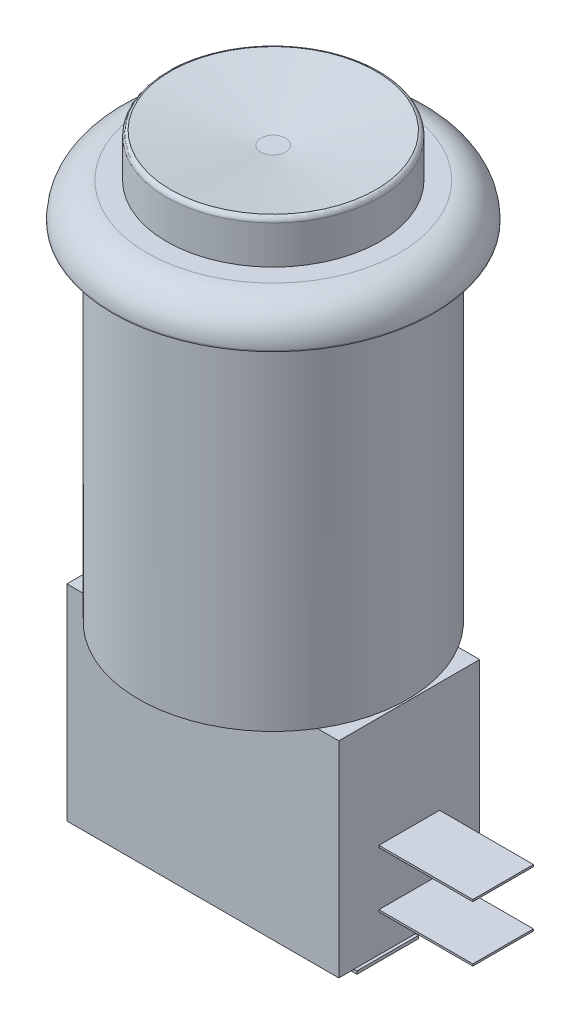
ISO-10303-21;
HEADER;
FILE_DESCRIPTION(('STEP AP214'),'2;1');
FILE_NAME('part.step','',(''),(''),'','','');
FILE_SCHEMA(('AUTOMOTIVE_DESIGN { 1 0 10303 214 1 1 1 1 }'));
ENDSEC;
DATA;
#1=APPLICATION_CONTEXT('core data for automotive mechanical design processes');
#2=APPLICATION_PROTOCOL_DEFINITION('international standard','automotive_design',2000,#1);
#3=PRODUCT_CONTEXT('',#1,'mechanical');
#4=PRODUCT('Part','Part','',(#3));
#5=PRODUCT_RELATED_PRODUCT_CATEGORY('part','',(#4));
#6=PRODUCT_DEFINITION_FORMATION('','',#4);
#7=PRODUCT_DEFINITION_CONTEXT('part definition',#1,'design');
#8=PRODUCT_DEFINITION('design','',#6,#7);
#9=PRODUCT_DEFINITION_SHAPE('','',#8);
#10=(LENGTH_UNIT() NAMED_UNIT(*) SI_UNIT(.MILLI.,.METRE.));
#11=(NAMED_UNIT(*) PLANE_ANGLE_UNIT() SI_UNIT($,.RADIAN.));
#12=(NAMED_UNIT(*) SI_UNIT($,.STERADIAN.) SOLID_ANGLE_UNIT());
#13=UNCERTAINTY_MEASURE_WITH_UNIT(LENGTH_MEASURE(1.E-05),#10,'distance_accuracy_value','');
#14=(GEOMETRIC_REPRESENTATION_CONTEXT(3) GLOBAL_UNCERTAINTY_ASSIGNED_CONTEXT((#13)) GLOBAL_UNIT_ASSIGNED_CONTEXT((#10,
#11,#12)) REPRESENTATION_CONTEXT('',''));
#15=CARTESIAN_POINT('',(0.,0.,0.));
#16=DIRECTION('',(0.,0.,1.));
#17=DIRECTION('',(1.,0.,0.));
#18=AXIS2_PLACEMENT_3D('',#15,#16,#17);
#19=CARTESIAN_POINT('',(13.9,-21.,-7.2));
#20=DIRECTION('',(-1.,0.,0.));
#21=DIRECTION('',(0.,0.,1.));
#22=AXIS2_PLACEMENT_3D('',#19,#20,#21);
#23=PLANE('',#22);
#24=DIRECTION('',(0.,1.,0.));
#25=VECTOR('',#24,1.);
#26=CARTESIAN_POINT('',(13.9,-17.2,-3.1));
#27=LINE('',#26,#25);
#28=CARTESIAN_POINT('',(13.9,-17.2,-3.1));
#29=VERTEX_POINT('',#28);
#30=CARTESIAN_POINT('',(13.9,-17.,-3.1));
#31=VERTEX_POINT('',#30);
#32=EDGE_CURVE('E195',#29,#31,#27,.T.);
#33=ORIENTED_EDGE('',*,*,#32,.F.);
#34=DIRECTION('',(0.,0.,-1.));
#35=VECTOR('',#34,1.);
#36=CARTESIAN_POINT('',(13.9,-17.2,-3.1));
#37=LINE('',#36,#35);
#38=CARTESIAN_POINT('',(13.9,-17.2,3.1));
#39=VERTEX_POINT('',#38);
#40=EDGE_CURVE('E208',#39,#29,#37,.T.);
#41=ORIENTED_EDGE('',*,*,#40,.F.);
#42=DIRECTION('',(0.,-1.,0.));
#43=VECTOR('',#42,1.);
#44=CARTESIAN_POINT('',(13.9,-17.2,3.1));
#45=LINE('',#44,#43);
#46=CARTESIAN_POINT('',(13.9,-17.,3.1));
#47=VERTEX_POINT('',#46);
#48=EDGE_CURVE('E217',#47,#39,#45,.T.);
#49=ORIENTED_EDGE('',*,*,#48,.F.);
#50=DIRECTION('',(0.,0.,1.));
#51=VECTOR('',#50,1.);
#52=CARTESIAN_POINT('',(13.9,-17.,-3.1));
#53=LINE('',#52,#51);
#54=EDGE_CURVE('E198',#31,#47,#53,.T.);
#55=ORIENTED_EDGE('',*,*,#54,.F.);
#56=EDGE_LOOP('',(#33,#41,#49,#55));
#57=FACE_BOUND('',#56,.T.);
#58=DIRECTION('',(0.,0.,1.));
#59=VECTOR('',#58,1.);
#60=CARTESIAN_POINT('',(13.9,0.,-7.2));
#61=LINE('',#60,#59);
#62=CARTESIAN_POINT('',(13.9,0.,-7.2));
#63=VERTEX_POINT('',#62);
#64=CARTESIAN_POINT('',(13.9,0.,7.2));
#65=VERTEX_POINT('',#64);
#66=EDGE_CURVE('E278',#63,#65,#61,.T.);
#67=ORIENTED_EDGE('',*,*,#66,.T.);
#68=DIRECTION('',(0.,1.,0.));
#69=VECTOR('',#68,1.);
#70=CARTESIAN_POINT('',(13.9,-21.,7.2));
#71=LINE('',#70,#69);
#72=CARTESIAN_POINT('',(13.9,-21.,7.2));
#73=VERTEX_POINT('',#72);
#74=EDGE_CURVE('E306',#73,#65,#71,.T.);
#75=ORIENTED_EDGE('',*,*,#74,.F.);
#76=DIRECTION('',(0.,0.,1.));
#77=VECTOR('',#76,1.);
#78=CARTESIAN_POINT('',(13.9,-21.,-7.2));
#79=LINE('',#78,#77);
#80=CARTESIAN_POINT('',(13.9,-21.,-7.2));
#81=VERTEX_POINT('',#80);
#82=EDGE_CURVE('E279',#81,#73,#79,.T.);
#83=ORIENTED_EDGE('',*,*,#82,.F.);
#84=DIRECTION('',(0.,1.,0.));
#85=VECTOR('',#84,1.);
#86=CARTESIAN_POINT('',(13.9,-21.,-7.2));
#87=LINE('',#86,#85);
#88=EDGE_CURVE('E288',#81,#63,#87,.T.);
#89=ORIENTED_EDGE('',*,*,#88,.T.);
#90=EDGE_LOOP('',(#67,#75,#83,#89));
#91=FACE_BOUND('',#90,.T.);
#92=DIRECTION('',(0.,1.,0.));
#93=VECTOR('',#92,1.);
#94=CARTESIAN_POINT('',(13.9,-11.5,-3.1));
#95=LINE('',#94,#93);
#96=CARTESIAN_POINT('',(13.9,-11.5,-3.1));
#97=VERTEX_POINT('',#96);
#98=CARTESIAN_POINT('',(13.9,-11.3,-3.1));
#99=VERTEX_POINT('',#98);
#100=EDGE_CURVE('E194',#97,#99,#95,.T.);
#101=ORIENTED_EDGE('',*,*,#100,.F.);
#102=DIRECTION('',(0.,0.,-1.));
#103=VECTOR('',#102,1.);
#104=CARTESIAN_POINT('',(13.9,-11.5,-3.1));
#105=LINE('',#104,#103);
#106=CARTESIAN_POINT('',(13.9,-11.5,3.1));
#107=VERTEX_POINT('',#106);
#108=EDGE_CURVE('E191',#107,#97,#105,.T.);
#109=ORIENTED_EDGE('',*,*,#108,.F.);
#110=DIRECTION('',(0.,-1.,0.));
#111=VECTOR('',#110,1.);
#112=CARTESIAN_POINT('',(13.9,-11.5,3.1));
#113=LINE('',#112,#111);
#114=CARTESIAN_POINT('',(13.9,-11.3,3.1));
#115=VERTEX_POINT('',#114);
#116=EDGE_CURVE('E57',#115,#107,#113,.T.);
#117=ORIENTED_EDGE('',*,*,#116,.F.);
#118=DIRECTION('',(0.,0.,1.));
#119=VECTOR('',#118,1.);
#120=CARTESIAN_POINT('',(13.9,-11.3,-3.1));
#121=LINE('',#120,#119);
#122=EDGE_CURVE('E52',#99,#115,#121,.T.);
#123=ORIENTED_EDGE('',*,*,#122,.F.);
#124=EDGE_LOOP('',(#101,#109,#117,#123));
#125=FACE_BOUND('',#124,.T.);
#126=ADVANCED_FACE('F33',(#57,#91,#125),#23,.F.);
#127=CARTESIAN_POINT('',(0.,-21.,0.));
#128=DIRECTION('',(0.,1.,0.));
#129=DIRECTION('',(0.,0.,1.));
#130=AXIS2_PLACEMENT_3D('',#127,#128,#129);
#131=PLANE('',#130);
#132=DIRECTION('',(-1.,0.,0.));
#133=VECTOR('',#132,1.);
#134=CARTESIAN_POINT('',(11.7,-21.,3.15));
#135=LINE('',#134,#133);
#136=CARTESIAN_POINT('',(1.9,-21.,3.15));
#137=VERTEX_POINT('',#136);
#138=CARTESIAN_POINT('',(1.7,-21.,3.15));
#139=VERTEX_POINT('',#138);
#140=EDGE_CURVE('E248',#137,#139,#135,.T.);
#141=ORIENTED_EDGE('',*,*,#140,.F.);
#142=DIRECTION('',(0.,0.,1.));
#143=VECTOR('',#142,1.);
#144=CARTESIAN_POINT('',(1.9,-21.,-3.15));
#145=LINE('',#144,#143);
#146=CARTESIAN_POINT('',(1.9,-21.,-3.15));
#147=VERTEX_POINT('',#146);
#148=EDGE_CURVE('E237',#147,#137,#145,.T.);
#149=ORIENTED_EDGE('',*,*,#148,.F.);
#150=DIRECTION('',(1.,0.,0.));
#151=VECTOR('',#150,1.);
#152=CARTESIAN_POINT('',(11.7,-21.,-3.15));
#153=LINE('',#152,#151);
#154=CARTESIAN_POINT('',(1.7,-21.,-3.15));
#155=VERTEX_POINT('',#154);
#156=EDGE_CURVE('E254',#155,#147,#153,.T.);
#157=ORIENTED_EDGE('',*,*,#156,.F.);
#158=DIRECTION('',(0.,0.,-1.));
#159=VECTOR('',#158,1.);
#160=CARTESIAN_POINT('',(1.7,-21.,3.15));
#161=LINE('',#160,#159);
#162=EDGE_CURVE('E262',#139,#155,#161,.T.);
#163=ORIENTED_EDGE('',*,*,#162,.F.);
#164=EDGE_LOOP('',(#141,#149,#157,#163));
#165=FACE_BOUND('',#164,.T.);
#166=ORIENTED_EDGE('',*,*,#82,.T.);
#167=DIRECTION('',(-1.,0.,0.));
#168=VECTOR('',#167,1.);
#169=CARTESIAN_POINT('',(-13.9,-21.,7.2));
#170=LINE('',#169,#168);
#171=CARTESIAN_POINT('',(-13.9,-21.,7.2));
#172=VERTEX_POINT('',#171);
#173=EDGE_CURVE('E282',#73,#172,#170,.T.);
#174=ORIENTED_EDGE('',*,*,#173,.T.);
#175=DIRECTION('',(0.,0.,-1.));
#176=VECTOR('',#175,1.);
#177=CARTESIAN_POINT('',(-13.9,-21.,-7.2));
#178=LINE('',#177,#176);
#179=CARTESIAN_POINT('',(-13.9,-21.,-7.2));
#180=VERTEX_POINT('',#179);
#181=EDGE_CURVE('E284',#172,#180,#178,.T.);
#182=ORIENTED_EDGE('',*,*,#181,.T.);
#183=DIRECTION('',(1.,0.,0.));
#184=VECTOR('',#183,1.);
#185=CARTESIAN_POINT('',(-13.9,-21.,-7.2));
#186=LINE('',#185,#184);
#187=EDGE_CURVE('E286',#180,#81,#186,.T.);
#188=ORIENTED_EDGE('',*,*,#187,.T.);
#189=EDGE_LOOP('',(#166,#174,#182,#188));
#190=FACE_BOUND('',#189,.T.);
#191=ADVANCED_FACE('F359',(#165,#190),#131,.F.);
#192=CARTESIAN_POINT('',(0.,0.,0.));
#193=DIRECTION('',(0.,1.,0.));
#194=DIRECTION('',(0.,0.,1.));
#195=AXIS2_PLACEMENT_3D('',#192,#193,#194);
#196=PLANE('',#195);
#197=DIRECTION('',(1.,0.,0.));
#198=VECTOR('',#197,1.);
#199=CARTESIAN_POINT('',(-13.9,0.,-7.2));
#200=LINE('',#199,#198);
#201=CARTESIAN_POINT('',(-11.7142007836642,0.,-7.2));
#202=VERTEX_POINT('',#201);
#203=CARTESIAN_POINT('',(11.7142007836642,0.,-7.2));
#204=VERTEX_POINT('',#203);
#205=EDGE_CURVE('E11',#202,#204,#200,.T.);
#206=ORIENTED_EDGE('',*,*,#205,.F.);
#207=CARTESIAN_POINT('',(0.,0.,0.));
#208=DIRECTION('',(0.,1.,0.));
#209=DIRECTION('',(0.,0.,1.));
#210=AXIS2_PLACEMENT_3D('',#207,#208,#209);
#211=CIRCLE('',#210,13.75);
#212=EDGE_CURVE('E323',#204,#202,#211,.T.);
#213=ORIENTED_EDGE('',*,*,#212,.F.);
#214=EDGE_LOOP('',(#206,#213));
#215=FACE_BOUND('',#214,.T.);
#216=ADVANCED_FACE('F375',(#215),#196,.F.);
#217=DIRECTION('',(-1.,0.,0.));
#218=VECTOR('',#217,1.);
#219=CARTESIAN_POINT('',(-13.9,0.,7.2));
#220=LINE('',#219,#218);
#221=CARTESIAN_POINT('',(11.7142007836642,0.,7.2));
#222=VERTEX_POINT('',#221);
#223=CARTESIAN_POINT('',(-11.7142007836642,0.,7.2));
#224=VERTEX_POINT('',#223);
#225=EDGE_CURVE('E42',#222,#224,#220,.T.);
#226=ORIENTED_EDGE('',*,*,#225,.F.);
#227=EDGE_CURVE('E315',#224,#222,#211,.T.);
#228=ORIENTED_EDGE('',*,*,#227,.F.);
#229=EDGE_LOOP('',(#226,#228));
#230=FACE_BOUND('',#229,.T.);
#231=ADVANCED_FACE('F373',(#230),#196,.F.);
#232=CARTESIAN_POINT('',(0.,35.5,0.));
#233=DIRECTION('',(0.,-1.,0.));
#234=DIRECTION('',(0.,0.,-1.));
#235=AXIS2_PLACEMENT_3D('',#232,#233,#234);
#236=CYLINDRICAL_SURFACE('',#235,13.75);
#237=CARTESIAN_POINT('',(0.,35.5,0.));
#238=DIRECTION('',(0.,1.,0.));
#239=DIRECTION('',(0.,0.,1.));
#240=AXIS2_PLACEMENT_3D('',#237,#238,#239);
#241=CIRCLE('',#240,13.75);
#242=CARTESIAN_POINT('',(0.,35.5,13.75));
#243=VERTEX_POINT('',#242);
#244=EDGE_CURVE('E316',#243,#243,#241,.T.);
#245=ORIENTED_EDGE('',*,*,#244,.F.);
#246=EDGE_LOOP('',(#245));
#247=FACE_BOUND('',#246,.T.);
#248=EDGE_CURVE('E320',#222,#204,#211,.T.);
#249=ORIENTED_EDGE('',*,*,#248,.T.);
#250=ORIENTED_EDGE('',*,*,#212,.T.);
#251=EDGE_CURVE('E352',#202,#224,#211,.T.);
#252=ORIENTED_EDGE('',*,*,#251,.T.);
#253=ORIENTED_EDGE('',*,*,#227,.T.);
#254=EDGE_LOOP('',(#249,#250,#252,#253));
#255=FACE_BOUND('',#254,.T.);
#256=ADVANCED_FACE('F370',(#247,#255),#236,.T.);
#257=CARTESIAN_POINT('',(0.,39.1,0.));
#258=DIRECTION('',(0.,-1.,0.));
#259=DIRECTION('',(0.,0.,-1.));
#260=AXIS2_PLACEMENT_3D('',#257,#258,#259);
#261=CYLINDRICAL_SURFACE('',#260,16.4);
#262=CARTESIAN_POINT('',(0.,35.6,0.));
#263=DIRECTION('',(0.,1.,0.));
#264=DIRECTION('',(0.,0.,1.));
#265=AXIS2_PLACEMENT_3D('',#262,#263,#264);
#266=CIRCLE('',#265,16.4);
#267=CARTESIAN_POINT('',(0.,35.6,16.4));
#268=VERTEX_POINT('',#267);
#269=EDGE_CURVE('E326',#268,#268,#266,.F.);
#270=ORIENTED_EDGE('',*,*,#269,.T.);
#271=EDGE_LOOP('',(#270));
#272=FACE_BOUND('',#271,.T.);
#273=CARTESIAN_POINT('',(0.,35.5,0.));
#274=DIRECTION('',(0.,1.,0.));
#275=DIRECTION('',(0.,0.,1.));
#276=AXIS2_PLACEMENT_3D('',#273,#274,#275);
#277=CIRCLE('',#276,16.4);
#278=CARTESIAN_POINT('',(0.,35.5,16.4));
#279=VERTEX_POINT('',#278);
#280=EDGE_CURVE('E312',#279,#279,#277,.T.);
#281=ORIENTED_EDGE('',*,*,#280,.T.);
#282=EDGE_LOOP('',(#281));
#283=FACE_BOUND('',#282,.T.);
#284=ADVANCED_FACE('F381',(#272,#283),#261,.T.);
#285=CARTESIAN_POINT('',(0.,39.1,0.));
#286=DIRECTION('',(0.,1.,0.));
#287=DIRECTION('',(0.,0.,1.));
#288=AXIS2_PLACEMENT_3D('',#285,#286,#287);
#289=PLANE('',#288);
#290=CARTESIAN_POINT('',(0.,39.1,0.));
#291=DIRECTION('',(0.,1.,0.));
#292=DIRECTION('',(0.,0.,1.));
#293=AXIS2_PLACEMENT_3D('',#290,#291,#292);
#294=CIRCLE('',#293,12.9);
#295=CARTESIAN_POINT('',(0.,39.1,12.9));
#296=VERTEX_POINT('',#295);
#297=EDGE_CURVE('E319',#296,#296,#294,.T.);
#298=ORIENTED_EDGE('',*,*,#297,.T.);
#299=EDGE_LOOP('',(#298));
#300=FACE_BOUND('',#299,.T.);
#301=CARTESIAN_POINT('',(0.,39.1,0.));
#302=DIRECTION('',(0.,1.,0.));
#303=DIRECTION('',(0.,0.,1.));
#304=AXIS2_PLACEMENT_3D('',#301,#302,#303);
#305=CIRCLE('',#304,10.9);
#306=CARTESIAN_POINT('',(0.,39.1,10.9));
#307=VERTEX_POINT('',#306);
#308=EDGE_CURVE('E309',#307,#307,#305,.T.);
#309=ORIENTED_EDGE('',*,*,#308,.F.);
#310=EDGE_LOOP('',(#309));
#311=FACE_BOUND('',#310,.T.);
#312=ADVANCED_FACE('F406',(#300,#311),#289,.T.);
#313=CARTESIAN_POINT('',(0.,35.5,0.));
#314=DIRECTION('',(0.,1.,0.));
#315=DIRECTION('',(0.,0.,1.));
#316=AXIS2_PLACEMENT_3D('',#313,#314,#315);
#317=PLANE('',#316);
#318=ORIENTED_EDGE('',*,*,#244,.T.);
#319=EDGE_LOOP('',(#318));
#320=FACE_BOUND('',#319,.T.);
#321=ORIENTED_EDGE('',*,*,#280,.F.);
#322=EDGE_LOOP('',(#321));
#323=FACE_BOUND('',#322,.T.);
#324=ADVANCED_FACE('F405',(#320,#323),#317,.F.);
#325=CARTESIAN_POINT('',(0.,43.5,0.));
#326=DIRECTION('',(0.,-1.,0.));
#327=DIRECTION('',(0.,0.,-1.));
#328=AXIS2_PLACEMENT_3D('',#325,#326,#327);
#329=CYLINDRICAL_SURFACE('',#328,10.9);
#330=CARTESIAN_POINT('',(0.,43.0101020514434,0.));
#331=DIRECTION('',(0.,1.,0.));
#332=DIRECTION('',(0.,0.,1.));
#333=AXIS2_PLACEMENT_3D('',#330,#331,#332);
#334=CIRCLE('',#333,10.9);
#335=CARTESIAN_POINT('',(0.,43.0101020514434,10.9));
#336=VERTEX_POINT('',#335);
#337=EDGE_CURVE('E37',#336,#336,#334,.F.);
#338=ORIENTED_EDGE('',*,*,#337,.T.);
#339=EDGE_LOOP('',(#338));
#340=FACE_BOUND('',#339,.T.);
#341=ORIENTED_EDGE('',*,*,#308,.T.);
#342=EDGE_LOOP('',(#341));
#343=FACE_BOUND('',#342,.T.);
#344=ADVANCED_FACE('F402',(#340,#343),#329,.T.);
#345=CARTESIAN_POINT('',(0.,35.6,0.));
#346=DIRECTION('',(0.,1.,0.));
#347=DIRECTION('',(0.,0.,1.));
#348=AXIS2_PLACEMENT_3D('',#345,#346,#347);
#349=TOROIDAL_SURFACE('',#348,12.9,3.5);
#350=ORIENTED_EDGE('',*,*,#269,.F.);
#351=EDGE_LOOP('',(#350));
#352=FACE_BOUND('',#351,.T.);
#353=ORIENTED_EDGE('',*,*,#297,.F.);
#354=EDGE_LOOP('',(#353));
#355=FACE_BOUND('',#354,.T.);
#356=ADVANCED_FACE('F401',(#352,#355),#349,.T.);
#357=CARTESIAN_POINT('',(0.,42.2,0.));
#358=DIRECTION('',(0.,1.,0.));
#359=DIRECTION('',(0.,0.,1.));
#360=AXIS2_PLACEMENT_3D('',#357,#358,#359);
#361=PLANE('',#360);
#362=CARTESIAN_POINT('',(0.,42.2,0.));
#363=DIRECTION('',(0.,1.,0.));
#364=DIRECTION('',(0.,0.,1.));
#365=AXIS2_PLACEMENT_3D('',#362,#363,#364);
#366=CIRCLE('',#365,1.25001936090105);
#367=CARTESIAN_POINT('',(0.,42.2,1.25001936090103));
#368=VERTEX_POINT('',#367);
#369=EDGE_CURVE('E331',#368,#368,#366,.T.);
#370=ORIENTED_EDGE('',*,*,#369,.T.);
#371=EDGE_LOOP('',(#370));
#372=FACE_BOUND('',#371,.T.);
#373=ADVANCED_FACE('F397',(#372),#361,.T.);
#374=CARTESIAN_POINT('',(0.,42.094591652976,0.));
#375=DIRECTION('',(0.,1.,0.));
#376=DIRECTION('',(0.,0.,1.));
#377=AXIS2_PLACEMENT_3D('',#374,#375,#376);
#378=CONICAL_SURFACE('',#377,0.5,1.43116998663534);
#379=CARTESIAN_POINT('',(0.,43.5,0.));
#380=DIRECTION('',(0.,1.,0.));
#381=DIRECTION('',(0.,0.,1.));
#382=AXIS2_PLACEMENT_3D('',#379,#380,#381);
#383=CIRCLE('',#382,10.5);
#384=CARTESIAN_POINT('',(0.,43.5,10.5));
#385=VERTEX_POINT('',#384);
#386=EDGE_CURVE('E329',#385,#385,#383,.F.);
#387=CARTESIAN_POINT('',(0.,43.5,10.5));
#388=CARTESIAN_POINT('',(0.,43.4864583333333,10.4036460350094));
#389=CARTESIAN_POINT('',(0.,43.4729166666667,10.3072920700188));
#390=CARTESIAN_POINT('',(0.,43.4458333333333,10.1145841400375));
#391=CARTESIAN_POINT('',(0.,43.4322916666667,10.0182301750469));
#392=CARTESIAN_POINT('',(0.,43.4052083333333,9.82552224506569));
#393=CARTESIAN_POINT('',(0.,43.3916666666667,9.72916828007507));
#394=CARTESIAN_POINT('',(0.,43.3645833333333,9.53646035009384));
#395=CARTESIAN_POINT('',(0.,43.3510416666667,9.44010638510323));
#396=CARTESIAN_POINT('',(0.,43.3239583333333,9.247398455122));
#397=CARTESIAN_POINT('',(0.,43.3104166666667,9.15104449013138));
#398=CARTESIAN_POINT('',(0.,43.2833333333333,8.95833656015016));
#399=CARTESIAN_POINT('',(0.,43.2697916666667,8.86198259515954));
#400=CARTESIAN_POINT('',(0.,43.2427083333333,8.66927466517832));
#401=CARTESIAN_POINT('',(0.,43.2291666666667,8.5729207001877));
#402=CARTESIAN_POINT('',(0.,43.2020833333333,8.38021277020647));
#403=CARTESIAN_POINT('',(0.,43.1885416666667,8.28385880521586));
#404=CARTESIAN_POINT('',(0.,43.1614583333333,8.09115087523463));
#405=CARTESIAN_POINT('',(0.,43.1479166666667,7.99479691024402));
#406=CARTESIAN_POINT('',(0.,43.1208333333333,7.80208898026279));
#407=CARTESIAN_POINT('',(0.,43.1072916666667,7.70573501527217));
#408=CARTESIAN_POINT('',(0.,43.0802083333333,7.51302708529095));
#409=CARTESIAN_POINT('',(0.,43.0666666666667,7.41667312030033));
#410=CARTESIAN_POINT('',(0.,43.0395833333333,7.2239651903191));
#411=CARTESIAN_POINT('',(0.,43.0260416666667,7.12761122532849));
#412=CARTESIAN_POINT('',(0.,42.9989583333333,6.93490329534726));
#413=CARTESIAN_POINT('',(0.,42.9854166666667,6.83854933035665));
#414=CARTESIAN_POINT('',(0.,42.9583333333333,6.64584140037542));
#415=CARTESIAN_POINT('',(0.,42.9447916666667,6.5494874353848));
#416=CARTESIAN_POINT('',(0.,42.9177083333333,6.35677950540358));
#417=CARTESIAN_POINT('',(0.,42.9041666666667,6.26042554041296));
#418=CARTESIAN_POINT('',(0.,42.8770833333333,6.06771761043173));
#419=CARTESIAN_POINT('',(0.,42.8635416666667,5.97136364544112));
#420=CARTESIAN_POINT('',(0.,42.8364583333333,5.77865571545989));
#421=CARTESIAN_POINT('',(0.,42.8229166666667,5.68230175046928));
#422=CARTESIAN_POINT('',(0.,42.7958333333333,5.48959382048805));
#423=CARTESIAN_POINT('',(0.,42.7822916666667,5.39323985549744));
#424=CARTESIAN_POINT('',(0.,42.7552083333333,5.20053192551621));
#425=CARTESIAN_POINT('',(0.,42.7416666666667,5.10417796052559));
#426=CARTESIAN_POINT('',(0.,42.7145833333333,4.91147003054436));
#427=CARTESIAN_POINT('',(0.,42.7010416666667,4.81511606555375));
#428=CARTESIAN_POINT('',(0.,42.6739583333333,4.62240813557252));
#429=CARTESIAN_POINT('',(0.,42.6604166666667,4.52605417058191));
#430=CARTESIAN_POINT('',(0.,42.6333333333333,4.33334624060068));
#431=CARTESIAN_POINT('',(0.,42.6197916666667,4.23699227561007));
#432=CARTESIAN_POINT('',(0.,42.5927083333333,4.04428434562884));
#433=CARTESIAN_POINT('',(0.,42.5791666666667,3.94793038063822));
#434=CARTESIAN_POINT('',(0.,42.5520833333333,3.755222450657));
#435=CARTESIAN_POINT('',(0.,42.5385416666667,3.65886848566638));
#436=CARTESIAN_POINT('',(0.,42.5114583333333,3.46616055568515));
#437=CARTESIAN_POINT('',(0.,42.4979166666667,3.36980659069454));
#438=CARTESIAN_POINT('',(0.,42.4708333333333,3.17709866071331));
#439=CARTESIAN_POINT('',(0.,42.4572916666667,3.0807446957227));
#440=CARTESIAN_POINT('',(0.,42.4302083333333,2.88803676574147));
#441=CARTESIAN_POINT('',(0.,42.4166666666667,2.79168280075085));
#442=CARTESIAN_POINT('',(0.,42.3895833333333,2.59897487076963));
#443=CARTESIAN_POINT('',(0.,42.3760416666667,2.50262090577901));
#444=CARTESIAN_POINT('',(0.,42.3489583333333,2.30991297579778));
#445=CARTESIAN_POINT('',(0.,42.3354166666667,2.21355901080717));
#446=CARTESIAN_POINT('',(0.,42.3083333333333,2.02085108082594));
#447=CARTESIAN_POINT('',(0.,42.2947916666667,1.92449711583533));
#448=CARTESIAN_POINT('',(0.,42.2677083333333,1.7317891858541));
#449=CARTESIAN_POINT('',(0.,42.2541666666667,1.63543522086348));
#450=CARTESIAN_POINT('',(0.,42.2270833333333,1.44272729088226));
#451=CARTESIAN_POINT('',(0.,42.2135416666667,1.34637332589164));
#452=CARTESIAN_POINT('',(0.,42.2,1.25001936090103));
#453=B_SPLINE_CURVE_WITH_KNOTS('',3,(#387,#388,#389,#390,#391,#392,#393,#394,#395,#396,#397,
#398,#399,#400,#401,#402,#403,#404,#405,#406,#407,#408,#409,#410,#411,#412,#413,#414,#415,#416,
#417,#418,#419,#420,#421,#422,#423,#424,#425,#426,#427,#428,#429,#430,#431,#432,#433,#434,#435,
#436,#437,#438,#439,#440,#441,#442,#443,#444,#445,#446,#447,#448,#449,#450,#451,#452),
.UNSPECIFIED.,.F.,.F.,(4,2,2,2,2,2,2,2,2,2,2,2,2,2,2,2,2,2,2,2,2,2,2,2,2,2,2,2,2,2,2,2,4),(0.,
0.291902671707047,0.583805343414094,0.875708015121142,1.16761068682819,1.45951335853524,
1.75141603024228,2.04331870194933,2.33522137365638,2.62712404536343,2.91902671707048,
3.21092938877753,3.50283206048457,3.79473473219162,4.08663740389867,4.37854007560571,
4.67044274731276,4.96234541901981,5.25424809072686,5.5461507624339,5.83805343414095,
6.129956105848,6.42185877755505,6.71376144926209,7.00566412096914,7.29756679267619,
7.58946946438324,7.88137213609028,8.17327480779733,8.46517747950438,8.75708015121143,
9.04898282291848,9.34088549462552),.UNSPECIFIED.);
#454=EDGE_CURVE('BSEAM400',#385,#368,#453,.T.);
#455=ORIENTED_EDGE('',*,*,#386,.F.);
#456=ORIENTED_EDGE('',*,*,#369,.F.);
#457=ORIENTED_EDGE('',*,*,#454,.T.);
#458=ORIENTED_EDGE('',*,*,#454,.F.);
#459=EDGE_LOOP('',(#455,#457,#456,#458));
#460=FACE_BOUND('',#459,.T.);
#461=ADVANCED_FACE('F400',(#460),#378,.F.);
#462=CARTESIAN_POINT('',(0.,43.0101020514434,0.));
#463=DIRECTION('',(0.,1.,0.));
#464=DIRECTION('',(0.,0.,1.));
#465=AXIS2_PLACEMENT_3D('',#462,#463,#464);
#466=TOROIDAL_SURFACE('',#465,10.4,0.5);
#467=ORIENTED_EDGE('',*,*,#337,.F.);
#468=EDGE_LOOP('',(#467));
#469=FACE_BOUND('',#468,.T.);
#470=ORIENTED_EDGE('',*,*,#386,.T.);
#471=EDGE_LOOP('',(#470));
#472=FACE_BOUND('',#471,.T.);
#473=ADVANCED_FACE('F35',(#469,#472),#466,.T.);
#474=CARTESIAN_POINT('',(0.,0.,0.));
#475=DIRECTION('',(0.,1.,0.));
#476=DIRECTION('',(0.,0.,1.));
#477=AXIS2_PLACEMENT_3D('',#474,#475,#476);
#478=PLANE('',#477);
#479=ORIENTED_EDGE('',*,*,#248,.F.);
#480=EDGE_CURVE('E292',#65,#222,#220,.T.);
#481=ORIENTED_EDGE('',*,*,#480,.F.);
#482=ORIENTED_EDGE('',*,*,#66,.F.);
#483=EDGE_CURVE('E45',#204,#63,#200,.T.);
#484=ORIENTED_EDGE('',*,*,#483,.F.);
#485=EDGE_LOOP('',(#479,#481,#482,#484));
#486=FACE_BOUND('',#485,.T.);
#487=ADVANCED_FACE('F366',(#486),#478,.T.);
#488=ORIENTED_EDGE('',*,*,#251,.F.);
#489=CARTESIAN_POINT('',(-13.9,0.,-7.2));
#490=VERTEX_POINT('',#489);
#491=EDGE_CURVE('E44',#490,#202,#200,.T.);
#492=ORIENTED_EDGE('',*,*,#491,.F.);
#493=DIRECTION('',(0.,0.,-1.));
#494=VECTOR('',#493,1.);
#495=CARTESIAN_POINT('',(-13.9,0.,-7.2));
#496=LINE('',#495,#494);
#497=CARTESIAN_POINT('',(-13.9,0.,7.2));
#498=VERTEX_POINT('',#497);
#499=EDGE_CURVE('E295',#498,#490,#496,.T.);
#500=ORIENTED_EDGE('',*,*,#499,.F.);
#501=EDGE_CURVE('E291',#224,#498,#220,.T.);
#502=ORIENTED_EDGE('',*,*,#501,.F.);
#503=EDGE_LOOP('',(#488,#492,#500,#502));
#504=FACE_BOUND('',#503,.T.);
#505=ADVANCED_FACE('F351',(#504),#478,.T.);
#506=CARTESIAN_POINT('',(-13.9,-21.,7.2));
#507=DIRECTION('',(0.,0.,-1.));
#508=DIRECTION('',(-1.,0.,0.));
#509=AXIS2_PLACEMENT_3D('',#506,#507,#508);
#510=PLANE('',#509);
#511=ORIENTED_EDGE('',*,*,#480,.T.);
#512=ORIENTED_EDGE('',*,*,#225,.T.);
#513=ORIENTED_EDGE('',*,*,#501,.T.);
#514=DIRECTION('',(0.,1.,0.));
#515=VECTOR('',#514,1.);
#516=CARTESIAN_POINT('',(-13.9,-21.,7.2));
#517=LINE('',#516,#515);
#518=EDGE_CURVE('E303',#172,#498,#517,.T.);
#519=ORIENTED_EDGE('',*,*,#518,.F.);
#520=ORIENTED_EDGE('',*,*,#173,.F.);
#521=ORIENTED_EDGE('',*,*,#74,.T.);
#522=EDGE_LOOP('',(#511,#512,#513,#519,#520,#521));
#523=FACE_BOUND('',#522,.T.);
#524=ADVANCED_FACE('F342',(#523),#510,.F.);
#525=CARTESIAN_POINT('',(-13.9,-21.,-7.2));
#526=DIRECTION('',(1.,0.,0.));
#527=DIRECTION('',(0.,0.,-1.));
#528=AXIS2_PLACEMENT_3D('',#525,#526,#527);
#529=PLANE('',#528);
#530=ORIENTED_EDGE('',*,*,#499,.T.);
#531=DIRECTION('',(0.,1.,0.));
#532=VECTOR('',#531,1.);
#533=CARTESIAN_POINT('',(-13.9,-21.,-7.2));
#534=LINE('',#533,#532);
#535=EDGE_CURVE('E300',#180,#490,#534,.T.);
#536=ORIENTED_EDGE('',*,*,#535,.F.);
#537=ORIENTED_EDGE('',*,*,#181,.F.);
#538=ORIENTED_EDGE('',*,*,#518,.T.);
#539=EDGE_LOOP('',(#530,#536,#537,#538));
#540=FACE_BOUND('',#539,.T.);
#541=ADVANCED_FACE('F348',(#540),#529,.F.);
#542=CARTESIAN_POINT('',(-13.9,-21.,-7.2));
#543=DIRECTION('',(0.,0.,1.));
#544=DIRECTION('',(1.,0.,0.));
#545=AXIS2_PLACEMENT_3D('',#542,#543,#544);
#546=PLANE('',#545);
#547=ORIENTED_EDGE('',*,*,#491,.T.);
#548=ORIENTED_EDGE('',*,*,#205,.T.);
#549=ORIENTED_EDGE('',*,*,#483,.T.);
#550=ORIENTED_EDGE('',*,*,#88,.F.);
#551=ORIENTED_EDGE('',*,*,#187,.F.);
#552=ORIENTED_EDGE('',*,*,#535,.T.);
#553=EDGE_LOOP('',(#547,#548,#549,#550,#551,#552));
#554=FACE_BOUND('',#553,.T.);
#555=ADVANCED_FACE('F354',(#554),#546,.F.);
#556=CARTESIAN_POINT('',(11.7,-23.8,3.15));
#557=DIRECTION('',(-1.,0.,0.));
#558=DIRECTION('',(0.,0.,1.));
#559=AXIS2_PLACEMENT_3D('',#556,#557,#558);
#560=PLANE('',#559);
#561=DIRECTION('',(0.,1.,0.));
#562=VECTOR('',#561,1.);
#563=CARTESIAN_POINT('',(11.7,-23.8,-3.15));
#564=LINE('',#563,#562);
#565=CARTESIAN_POINT('',(11.7,-23.8,-3.15));
#566=VERTEX_POINT('',#565);
#567=CARTESIAN_POINT('',(11.7,-23.5,-3.15));
#568=VERTEX_POINT('',#567);
#569=EDGE_CURVE('E260',#566,#568,#564,.T.);
#570=ORIENTED_EDGE('',*,*,#569,.T.);
#571=DIRECTION('',(0.,0.,-1.));
#572=VECTOR('',#571,1.);
#573=CARTESIAN_POINT('',(11.7,-23.5,-3.15));
#574=LINE('',#573,#572);
#575=CARTESIAN_POINT('',(11.7,-23.5,3.15));
#576=VERTEX_POINT('',#575);
#577=EDGE_CURVE('E233',#576,#568,#574,.T.);
#578=ORIENTED_EDGE('',*,*,#577,.F.);
#579=DIRECTION('',(0.,1.,0.));
#580=VECTOR('',#579,1.);
#581=CARTESIAN_POINT('',(11.7,-23.8,3.15));
#582=LINE('',#581,#580);
#583=CARTESIAN_POINT('',(11.7,-23.8,3.15));
#584=VERTEX_POINT('',#583);
#585=EDGE_CURVE('E275',#584,#576,#582,.T.);
#586=ORIENTED_EDGE('',*,*,#585,.F.);
#587=DIRECTION('',(0.,0.,1.));
#588=VECTOR('',#587,1.);
#589=CARTESIAN_POINT('',(11.7,-23.8,3.15));
#590=LINE('',#589,#588);
#591=EDGE_CURVE('E250',#566,#584,#590,.T.);
#592=ORIENTED_EDGE('',*,*,#591,.F.);
#593=EDGE_LOOP('',(#570,#578,#586,#592));
#594=FACE_BOUND('',#593,.T.);
#595=ADVANCED_FACE('F449',(#594),#560,.F.);
#596=CARTESIAN_POINT('',(11.7,-23.8,3.15));
#597=DIRECTION('',(0.,0.,-1.));
#598=DIRECTION('',(-1.,0.,0.));
#599=AXIS2_PLACEMENT_3D('',#596,#597,#598);
#600=PLANE('',#599);
#601=ORIENTED_EDGE('',*,*,#585,.T.);
#602=DIRECTION('',(1.,0.,0.));
#603=VECTOR('',#602,1.);
#604=CARTESIAN_POINT('',(1.9,-23.5,3.15));
#605=LINE('',#604,#603);
#606=CARTESIAN_POINT('',(1.9,-23.5,3.15));
#607=VERTEX_POINT('',#606);
#608=EDGE_CURVE('E243',#607,#576,#605,.T.);
#609=ORIENTED_EDGE('',*,*,#608,.F.);
#610=DIRECTION('',(0.,-1.,0.));
#611=VECTOR('',#610,1.);
#612=CARTESIAN_POINT('',(1.9,-21.,3.15));
#613=LINE('',#612,#611);
#614=EDGE_CURVE('E239',#137,#607,#613,.T.);
#615=ORIENTED_EDGE('',*,*,#614,.F.);
#616=ORIENTED_EDGE('',*,*,#140,.T.);
#617=DIRECTION('',(0.,1.,0.));
#618=VECTOR('',#617,1.);
#619=CARTESIAN_POINT('',(1.7,-23.8,3.15));
#620=LINE('',#619,#618);
#621=CARTESIAN_POINT('',(1.7,-23.8,3.15));
#622=VERTEX_POINT('',#621);
#623=EDGE_CURVE('E272',#622,#139,#620,.T.);
#624=ORIENTED_EDGE('',*,*,#623,.F.);
#625=DIRECTION('',(-1.,0.,0.));
#626=VECTOR('',#625,1.);
#627=CARTESIAN_POINT('',(11.7,-23.8,3.15));
#628=LINE('',#627,#626);
#629=EDGE_CURVE('E253',#584,#622,#628,.T.);
#630=ORIENTED_EDGE('',*,*,#629,.F.);
#631=EDGE_LOOP('',(#601,#609,#615,#616,#624,#630));
#632=FACE_BOUND('',#631,.T.);
#633=ADVANCED_FACE('F543',(#632),#600,.F.);
#634=CARTESIAN_POINT('',(1.7,-23.8,3.15));
#635=DIRECTION('',(1.,0.,0.));
#636=DIRECTION('',(0.,0.,-1.));
#637=AXIS2_PLACEMENT_3D('',#634,#635,#636);
#638=PLANE('',#637);
#639=ORIENTED_EDGE('',*,*,#162,.T.);
#640=DIRECTION('',(0.,1.,0.));
#641=VECTOR('',#640,1.);
#642=CARTESIAN_POINT('',(1.7,-23.8,-3.15));
#643=LINE('',#642,#641);
#644=CARTESIAN_POINT('',(1.7,-23.8,-3.15));
#645=VERTEX_POINT('',#644);
#646=EDGE_CURVE('E269',#645,#155,#643,.T.);
#647=ORIENTED_EDGE('',*,*,#646,.F.);
#648=DIRECTION('',(0.,0.,-1.));
#649=VECTOR('',#648,1.);
#650=CARTESIAN_POINT('',(1.7,-23.8,3.15));
#651=LINE('',#650,#649);
#652=EDGE_CURVE('E256',#622,#645,#651,.T.);
#653=ORIENTED_EDGE('',*,*,#652,.F.);
#654=ORIENTED_EDGE('',*,*,#623,.T.);
#655=EDGE_LOOP('',(#639,#647,#653,#654));
#656=FACE_BOUND('',#655,.T.);
#657=ADVANCED_FACE('F552',(#656),#638,.F.);
#658=CARTESIAN_POINT('',(11.7,-23.8,-3.15));
#659=DIRECTION('',(0.,0.,1.));
#660=DIRECTION('',(1.,0.,0.));
#661=AXIS2_PLACEMENT_3D('',#658,#659,#660);
#662=PLANE('',#661);
#663=DIRECTION('',(0.,1.,0.));
#664=VECTOR('',#663,1.);
#665=CARTESIAN_POINT('',(1.9,-21.,-3.15));
#666=LINE('',#665,#664);
#667=CARTESIAN_POINT('',(1.9,-23.5,-3.15));
#668=VERTEX_POINT('',#667);
#669=EDGE_CURVE('E234',#668,#147,#666,.T.);
#670=ORIENTED_EDGE('',*,*,#669,.F.);
#671=DIRECTION('',(1.,0.,0.));
#672=VECTOR('',#671,1.);
#673=CARTESIAN_POINT('',(1.9,-23.5,-3.15));
#674=LINE('',#673,#672);
#675=EDGE_CURVE('E245',#668,#568,#674,.T.);
#676=ORIENTED_EDGE('',*,*,#675,.T.);
#677=ORIENTED_EDGE('',*,*,#569,.F.);
#678=DIRECTION('',(1.,0.,0.));
#679=VECTOR('',#678,1.);
#680=CARTESIAN_POINT('',(11.7,-23.8,-3.15));
#681=LINE('',#680,#679);
#682=EDGE_CURVE('E258',#645,#566,#681,.T.);
#683=ORIENTED_EDGE('',*,*,#682,.F.);
#684=ORIENTED_EDGE('',*,*,#646,.T.);
#685=ORIENTED_EDGE('',*,*,#156,.T.);
#686=EDGE_LOOP('',(#670,#676,#677,#683,#684,#685));
#687=FACE_BOUND('',#686,.T.);
#688=ADVANCED_FACE('F560',(#687),#662,.F.);
#689=CARTESIAN_POINT('',(0.,-23.8,0.));
#690=DIRECTION('',(0.,1.,0.));
#691=DIRECTION('',(0.,0.,1.));
#692=AXIS2_PLACEMENT_3D('',#689,#690,#691);
#693=PLANE('',#692);
#694=ORIENTED_EDGE('',*,*,#591,.T.);
#695=ORIENTED_EDGE('',*,*,#629,.T.);
#696=ORIENTED_EDGE('',*,*,#652,.T.);
#697=ORIENTED_EDGE('',*,*,#682,.T.);
#698=EDGE_LOOP('',(#694,#695,#696,#697));
#699=FACE_BOUND('',#698,.T.);
#700=ADVANCED_FACE('F535',(#699),#693,.F.);
#701=CARTESIAN_POINT('',(1.9,-23.5,-3.15));
#702=DIRECTION('',(0.,-1.,0.));
#703=DIRECTION('',(0.,0.,-1.));
#704=AXIS2_PLACEMENT_3D('',#701,#702,#703);
#705=PLANE('',#704);
#706=ORIENTED_EDGE('',*,*,#577,.T.);
#707=ORIENTED_EDGE('',*,*,#675,.F.);
#708=DIRECTION('',(0.,0.,-1.));
#709=VECTOR('',#708,1.);
#710=CARTESIAN_POINT('',(1.9,-23.5,-3.15));
#711=LINE('',#710,#709);
#712=EDGE_CURVE('E241',#607,#668,#711,.T.);
#713=ORIENTED_EDGE('',*,*,#712,.F.);
#714=ORIENTED_EDGE('',*,*,#608,.T.);
#715=EDGE_LOOP('',(#706,#707,#713,#714));
#716=FACE_BOUND('',#715,.T.);
#717=ADVANCED_FACE('F570',(#716),#705,.F.);
#718=CARTESIAN_POINT('',(1.9,0.,0.));
#719=DIRECTION('',(-1.,0.,0.));
#720=DIRECTION('',(0.,0.,1.));
#721=AXIS2_PLACEMENT_3D('',#718,#719,#720);
#722=PLANE('',#721);
#723=ORIENTED_EDGE('',*,*,#669,.T.);
#724=ORIENTED_EDGE('',*,*,#148,.T.);
#725=ORIENTED_EDGE('',*,*,#614,.T.);
#726=ORIENTED_EDGE('',*,*,#712,.T.);
#727=EDGE_LOOP('',(#723,#724,#725,#726));
#728=FACE_BOUND('',#727,.T.);
#729=ADVANCED_FACE('F574',(#728),#722,.F.);
#730=CARTESIAN_POINT('',(23.5,-17.2,-3.1));
#731=DIRECTION('',(0.,0.,1.));
#732=DIRECTION('',(1.,0.,0.));
#733=AXIS2_PLACEMENT_3D('',#730,#731,#732);
#734=PLANE('',#733);
#735=ORIENTED_EDGE('',*,*,#32,.T.);
#736=DIRECTION('',(-1.,0.,0.));
#737=VECTOR('',#736,1.);
#738=CARTESIAN_POINT('',(23.5,-17.,-3.1));
#739=LINE('',#738,#737);
#740=CARTESIAN_POINT('',(23.5,-17.,-3.1));
#741=VERTEX_POINT('',#740);
#742=EDGE_CURVE('E230',#741,#31,#739,.T.);
#743=ORIENTED_EDGE('',*,*,#742,.F.);
#744=DIRECTION('',(0.,1.,0.));
#745=VECTOR('',#744,1.);
#746=CARTESIAN_POINT('',(23.5,-17.2,-3.1));
#747=LINE('',#746,#745);
#748=CARTESIAN_POINT('',(23.5,-17.2,-3.1));
#749=VERTEX_POINT('',#748);
#750=EDGE_CURVE('E204',#749,#741,#747,.T.);
#751=ORIENTED_EDGE('',*,*,#750,.F.);
#752=DIRECTION('',(-1.,0.,0.));
#753=VECTOR('',#752,1.);
#754=CARTESIAN_POINT('',(23.5,-17.2,-3.1));
#755=LINE('',#754,#753);
#756=EDGE_CURVE('E213',#749,#29,#755,.T.);
#757=ORIENTED_EDGE('',*,*,#756,.T.);
#758=EDGE_LOOP('',(#735,#743,#751,#757));
#759=FACE_BOUND('',#758,.T.);
#760=ADVANCED_FACE('F583',(#759),#734,.F.);
#761=CARTESIAN_POINT('',(23.5,-17.,-3.1));
#762=DIRECTION('',(0.,-1.,0.));
#763=DIRECTION('',(0.,0.,-1.));
#764=AXIS2_PLACEMENT_3D('',#761,#762,#763);
#765=PLANE('',#764);
#766=ORIENTED_EDGE('',*,*,#54,.T.);
#767=DIRECTION('',(-1.,0.,0.));
#768=VECTOR('',#767,1.);
#769=CARTESIAN_POINT('',(23.5,-17.,3.1));
#770=LINE('',#769,#768);
#771=CARTESIAN_POINT('',(23.5,-17.,3.1));
#772=VERTEX_POINT('',#771);
#773=EDGE_CURVE('E227',#772,#47,#770,.T.);
#774=ORIENTED_EDGE('',*,*,#773,.F.);
#775=DIRECTION('',(0.,0.,1.));
#776=VECTOR('',#775,1.);
#777=CARTESIAN_POINT('',(23.5,-17.,-3.1));
#778=LINE('',#777,#776);
#779=EDGE_CURVE('E207',#741,#772,#778,.T.);
#780=ORIENTED_EDGE('',*,*,#779,.F.);
#781=ORIENTED_EDGE('',*,*,#742,.T.);
#782=EDGE_LOOP('',(#766,#774,#780,#781));
#783=FACE_BOUND('',#782,.T.);
#784=ADVANCED_FACE('F598',(#783),#765,.F.);
#785=CARTESIAN_POINT('',(23.5,-17.2,3.1));
#786=DIRECTION('',(0.,0.,-1.));
#787=DIRECTION('',(-1.,0.,0.));
#788=AXIS2_PLACEMENT_3D('',#785,#786,#787);
#789=PLANE('',#788);
#790=ORIENTED_EDGE('',*,*,#48,.T.);
#791=DIRECTION('',(-1.,0.,0.));
#792=VECTOR('',#791,1.);
#793=CARTESIAN_POINT('',(23.5,-17.2,3.1));
#794=LINE('',#793,#792);
#795=CARTESIAN_POINT('',(23.5,-17.2,3.1));
#796=VERTEX_POINT('',#795);
#797=EDGE_CURVE('E224',#796,#39,#794,.T.);
#798=ORIENTED_EDGE('',*,*,#797,.F.);
#799=DIRECTION('',(0.,-1.,0.));
#800=VECTOR('',#799,1.);
#801=CARTESIAN_POINT('',(23.5,-17.2,3.1));
#802=LINE('',#801,#800);
#803=EDGE_CURVE('E210',#772,#796,#802,.T.);
#804=ORIENTED_EDGE('',*,*,#803,.F.);
#805=ORIENTED_EDGE('',*,*,#773,.T.);
#806=EDGE_LOOP('',(#790,#798,#804,#805));
#807=FACE_BOUND('',#806,.T.);
#808=ADVANCED_FACE('F608',(#807),#789,.F.);
#809=CARTESIAN_POINT('',(23.5,-17.2,-3.1));
#810=DIRECTION('',(0.,1.,0.));
#811=DIRECTION('',(0.,0.,1.));
#812=AXIS2_PLACEMENT_3D('',#809,#810,#811);
#813=PLANE('',#812);
#814=ORIENTED_EDGE('',*,*,#40,.T.);
#815=ORIENTED_EDGE('',*,*,#756,.F.);
#816=DIRECTION('',(0.,0.,-1.));
#817=VECTOR('',#816,1.);
#818=CARTESIAN_POINT('',(23.5,-17.2,-3.1));
#819=LINE('',#818,#817);
#820=EDGE_CURVE('E212',#796,#749,#819,.T.);
#821=ORIENTED_EDGE('',*,*,#820,.F.);
#822=ORIENTED_EDGE('',*,*,#797,.T.);
#823=EDGE_LOOP('',(#814,#815,#821,#822));
#824=FACE_BOUND('',#823,.T.);
#825=ADVANCED_FACE('F618',(#824),#813,.F.);
#826=CARTESIAN_POINT('',(23.5,0.,0.));
#827=DIRECTION('',(1.,0.,0.));
#828=DIRECTION('',(0.,0.,-1.));
#829=AXIS2_PLACEMENT_3D('',#826,#827,#828);
#830=PLANE('',#829);
#831=ORIENTED_EDGE('',*,*,#750,.T.);
#832=ORIENTED_EDGE('',*,*,#779,.T.);
#833=ORIENTED_EDGE('',*,*,#803,.T.);
#834=ORIENTED_EDGE('',*,*,#820,.T.);
#835=EDGE_LOOP('',(#831,#832,#833,#834));
#836=FACE_BOUND('',#835,.T.);
#837=ADVANCED_FACE('F628',(#836),#830,.T.);
#838=CARTESIAN_POINT('',(23.5,-11.5,-3.1));
#839=DIRECTION('',(0.,0.,1.));
#840=DIRECTION('',(1.,0.,0.));
#841=AXIS2_PLACEMENT_3D('',#838,#839,#840);
#842=PLANE('',#841);
#843=ORIENTED_EDGE('',*,*,#100,.T.);
#844=DIRECTION('',(-1.,0.,0.));
#845=VECTOR('',#844,1.);
#846=CARTESIAN_POINT('',(23.5,-11.3,-3.1));
#847=LINE('',#846,#845);
#848=CARTESIAN_POINT('',(23.5,-11.3,-3.1));
#849=VERTEX_POINT('',#848);
#850=EDGE_CURVE('E175',#849,#99,#847,.T.);
#851=ORIENTED_EDGE('',*,*,#850,.F.);
#852=DIRECTION('',(0.,1.,0.));
#853=VECTOR('',#852,1.);
#854=CARTESIAN_POINT('',(23.5,-11.5,-3.1));
#855=LINE('',#854,#853);
#856=CARTESIAN_POINT('',(23.5,-11.5,-3.1));
#857=VERTEX_POINT('',#856);
#858=EDGE_CURVE('E182',#857,#849,#855,.T.);
#859=ORIENTED_EDGE('',*,*,#858,.F.);
#860=DIRECTION('',(-1.,0.,0.));
#861=VECTOR('',#860,1.);
#862=CARTESIAN_POINT('',(23.5,-11.5,-3.1));
#863=LINE('',#862,#861);
#864=EDGE_CURVE('E726',#857,#97,#863,.T.);
#865=ORIENTED_EDGE('',*,*,#864,.T.);
#866=EDGE_LOOP('',(#843,#851,#859,#865));
#867=FACE_BOUND('',#866,.T.);
#868=ADVANCED_FACE('F193',(#867),#842,.F.);
#869=CARTESIAN_POINT('',(23.5,-11.3,-3.1));
#870=DIRECTION('',(0.,-1.,0.));
#871=DIRECTION('',(0.,0.,-1.));
#872=AXIS2_PLACEMENT_3D('',#869,#870,#871);
#873=PLANE('',#872);
#874=ORIENTED_EDGE('',*,*,#122,.T.);
#875=DIRECTION('',(-1.,0.,0.));
#876=VECTOR('',#875,1.);
#877=CARTESIAN_POINT('',(23.5,-11.3,3.1));
#878=LINE('',#877,#876);
#879=CARTESIAN_POINT('',(23.5,-11.3,3.1));
#880=VERTEX_POINT('',#879);
#881=EDGE_CURVE('E178',#880,#115,#878,.T.);
#882=ORIENTED_EDGE('',*,*,#881,.F.);
#883=DIRECTION('',(0.,0.,1.));
#884=VECTOR('',#883,1.);
#885=CARTESIAN_POINT('',(23.5,-11.3,-3.1));
#886=LINE('',#885,#884);
#887=EDGE_CURVE('E171',#849,#880,#886,.T.);
#888=ORIENTED_EDGE('',*,*,#887,.F.);
#889=ORIENTED_EDGE('',*,*,#850,.T.);
#890=EDGE_LOOP('',(#874,#882,#888,#889));
#891=FACE_BOUND('',#890,.T.);
#892=ADVANCED_FACE('F173',(#891),#873,.F.);
#893=CARTESIAN_POINT('',(23.5,-11.5,3.1));
#894=DIRECTION('',(0.,0.,-1.));
#895=DIRECTION('',(-1.,0.,0.));
#896=AXIS2_PLACEMENT_3D('',#893,#894,#895);
#897=PLANE('',#896);
#898=ORIENTED_EDGE('',*,*,#116,.T.);
#899=DIRECTION('',(-1.,0.,0.));
#900=VECTOR('',#899,1.);
#901=CARTESIAN_POINT('',(23.5,-11.5,3.1));
#902=LINE('',#901,#900);
#903=CARTESIAN_POINT('',(23.5,-11.5,3.1));
#904=VERTEX_POINT('',#903);
#905=EDGE_CURVE('E200',#904,#107,#902,.T.);
#906=ORIENTED_EDGE('',*,*,#905,.F.);
#907=DIRECTION('',(0.,-1.,0.));
#908=VECTOR('',#907,1.);
#909=CARTESIAN_POINT('',(23.5,-11.5,3.1));
#910=LINE('',#909,#908);
#911=EDGE_CURVE('E181',#880,#904,#910,.T.);
#912=ORIENTED_EDGE('',*,*,#911,.F.);
#913=ORIENTED_EDGE('',*,*,#881,.T.);
#914=EDGE_LOOP('',(#898,#906,#912,#913));
#915=FACE_BOUND('',#914,.T.);
#916=ADVANCED_FACE('F655',(#915),#897,.F.);
#917=CARTESIAN_POINT('',(23.5,-11.5,-3.1));
#918=DIRECTION('',(0.,1.,0.));
#919=DIRECTION('',(0.,0.,1.));
#920=AXIS2_PLACEMENT_3D('',#917,#918,#919);
#921=PLANE('',#920);
#922=ORIENTED_EDGE('',*,*,#108,.T.);
#923=ORIENTED_EDGE('',*,*,#864,.F.);
#924=DIRECTION('',(0.,0.,-1.));
#925=VECTOR('',#924,1.);
#926=CARTESIAN_POINT('',(23.5,-11.5,-3.1));
#927=LINE('',#926,#925);
#928=EDGE_CURVE('E187',#904,#857,#927,.T.);
#929=ORIENTED_EDGE('',*,*,#928,.F.);
#930=ORIENTED_EDGE('',*,*,#905,.T.);
#931=EDGE_LOOP('',(#922,#923,#929,#930));
#932=FACE_BOUND('',#931,.T.);
#933=ADVANCED_FACE('F664',(#932),#921,.F.);
#934=CARTESIAN_POINT('',(23.5,0.,0.));
#935=DIRECTION('',(1.,0.,0.));
#936=DIRECTION('',(0.,0.,-1.));
#937=AXIS2_PLACEMENT_3D('',#934,#935,#936);
#938=PLANE('',#937);
#939=ORIENTED_EDGE('',*,*,#858,.T.);
#940=ORIENTED_EDGE('',*,*,#887,.T.);
#941=ORIENTED_EDGE('',*,*,#911,.T.);
#942=ORIENTED_EDGE('',*,*,#928,.T.);
#943=EDGE_LOOP('',(#939,#940,#941,#942));
#944=FACE_BOUND('',#943,.T.);
#945=ADVANCED_FACE('F185',(#944),#938,.T.);
#946=CLOSED_SHELL('',(#126,#191,#216,#231,#256,#284,#312,#324,#344,#356,#373,#461,#473,#487,
#505,#524,#541,#555,#595,#633,#657,#688,#700,#717,#729,#760,#784,#808,#825,#837,#868,#892,#916,
#933,#945));
#947=MANIFOLD_SOLID_BREP('B2',#946);
#948=ADVANCED_BREP_SHAPE_REPRESENTATION('',(#18,#947),#14);
#949=SHAPE_DEFINITION_REPRESENTATION(#9,#948);
ENDSEC;
END-ISO-10303-21;
